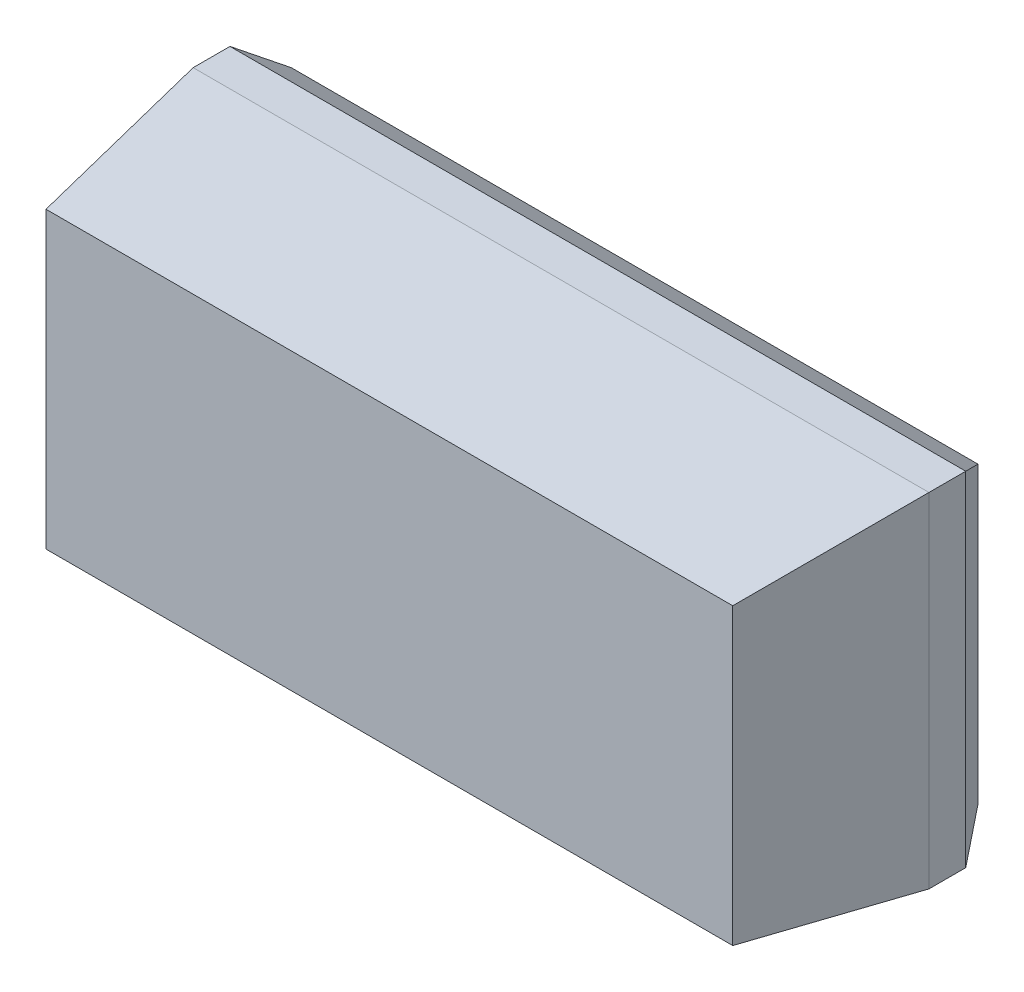
ISO-10303-21;
HEADER;
FILE_DESCRIPTION(('STEP AP214'),'2;1');
FILE_NAME('part.step','',(''),(''),'','','');
FILE_SCHEMA(('AUTOMOTIVE_DESIGN { 1 0 10303 214 1 1 1 1 }'));
ENDSEC;
DATA;
#1=APPLICATION_CONTEXT('core data for automotive mechanical design processes');
#2=APPLICATION_PROTOCOL_DEFINITION('international standard','automotive_design',2000,#1);
#3=PRODUCT_CONTEXT('',#1,'mechanical');
#4=PRODUCT('Part','Part','',(#3));
#5=PRODUCT_RELATED_PRODUCT_CATEGORY('part','',(#4));
#6=PRODUCT_DEFINITION_FORMATION('','',#4);
#7=PRODUCT_DEFINITION_CONTEXT('part definition',#1,'design');
#8=PRODUCT_DEFINITION('design','',#6,#7);
#9=PRODUCT_DEFINITION_SHAPE('','',#8);
#10=(LENGTH_UNIT() NAMED_UNIT(*) SI_UNIT(.MILLI.,.METRE.));
#11=(NAMED_UNIT(*) PLANE_ANGLE_UNIT() SI_UNIT($,.RADIAN.));
#12=(NAMED_UNIT(*) SI_UNIT($,.STERADIAN.) SOLID_ANGLE_UNIT());
#13=UNCERTAINTY_MEASURE_WITH_UNIT(LENGTH_MEASURE(1.E-05),#10,'distance_accuracy_value','');
#14=(GEOMETRIC_REPRESENTATION_CONTEXT(3) GLOBAL_UNCERTAINTY_ASSIGNED_CONTEXT((#13)) GLOBAL_UNIT_ASSIGNED_CONTEXT((#10,
#11,#12)) REPRESENTATION_CONTEXT('',''));
#15=CARTESIAN_POINT('',(0.,0.,0.));
#16=DIRECTION('',(0.,0.,1.));
#17=DIRECTION('',(1.,0.,0.));
#18=AXIS2_PLACEMENT_3D('',#15,#16,#17);
#19=CARTESIAN_POINT('',(0.,0.,0.));
#20=DIRECTION('',(0.,0.,1.));
#21=DIRECTION('',(1.,0.,0.));
#22=AXIS2_PLACEMENT_3D('',#19,#20,#21);
#23=PLANE('',#22);
#24=DIRECTION('',(0.,1.,0.));
#25=VECTOR('',#24,1.);
#26=CARTESIAN_POINT('',(1.40000000000004,-0.7,0.));
#27=LINE('',#26,#25);
#28=CARTESIAN_POINT('',(1.40000000000002,0.60000000000001,0.));
#29=VERTEX_POINT('',#28);
#30=CARTESIAN_POINT('',(1.40000000000001,-0.600000000000021,0.));
#31=VERTEX_POINT('',#30);
#32=EDGE_CURVE('E93',#29,#31,#27,.F.);
#33=ORIENTED_EDGE('',*,*,#32,.T.);
#34=DIRECTION('',(1.,0.,0.));
#35=VECTOR('',#34,1.);
#36=CARTESIAN_POINT('',(-1.5,-0.600000000000042,0.));
#37=LINE('',#36,#35);
#38=CARTESIAN_POINT('',(-1.40000000000002,-0.60000000000001,0.));
#39=VERTEX_POINT('',#38);
#40=EDGE_CURVE('E80',#31,#39,#37,.F.);
#41=ORIENTED_EDGE('',*,*,#40,.T.);
#42=DIRECTION('',(0.,1.,0.));
#43=VECTOR('',#42,1.);
#44=CARTESIAN_POINT('',(-1.40000000000004,0.7,0.));
#45=LINE('',#44,#43);
#46=CARTESIAN_POINT('',(-1.40000000000002,0.60000000000001,0.));
#47=VERTEX_POINT('',#46);
#48=EDGE_CURVE('E20',#39,#47,#45,.T.);
#49=ORIENTED_EDGE('',*,*,#48,.T.);
#50=DIRECTION('',(1.,0.,0.));
#51=VECTOR('',#50,1.);
#52=CARTESIAN_POINT('',(1.5,0.600000000000042,0.));
#53=LINE('',#52,#51);
#54=EDGE_CURVE('E108',#47,#29,#53,.T.);
#55=ORIENTED_EDGE('',*,*,#54,.T.);
#56=EDGE_LOOP('',(#33,#41,#49,#55));
#57=FACE_BOUND('',#56,.T.);
#58=ADVANCED_FACE('F17',(#57),#23,.F.);
#59=CARTESIAN_POINT('',(-1.5,0.7,0.15));
#60=DIRECTION('',(0.832050294337997,0.,0.554700196224998));
#61=DIRECTION('',(0.554700196224998,0.,-0.832050294337997));
#62=AXIS2_PLACEMENT_3D('',#59,#60,#61);
#63=PLANE('',#62);
#64=DIRECTION('',(0.485071250072667,-0.485071250072464,-0.727606875109133));
#65=VECTOR('',#64,1.);
#66=CARTESIAN_POINT('',(-1.5,0.7,0.15));
#67=LINE('',#66,#65);
#68=CARTESIAN_POINT('',(-1.5,0.7,0.15));
#69=VERTEX_POINT('',#68);
#70=EDGE_CURVE('E89',#69,#47,#67,.T.);
#71=ORIENTED_EDGE('',*,*,#70,.T.);
#72=ORIENTED_EDGE('',*,*,#48,.F.);
#73=DIRECTION('',(-0.485071250072666,-0.485071250072464,0.727606875109133));
#74=VECTOR('',#73,1.);
#75=CARTESIAN_POINT('',(-1.4,-0.600000000000042,0.));
#76=LINE('',#75,#74);
#77=CARTESIAN_POINT('',(-1.5,-0.7,0.15));
#78=VERTEX_POINT('',#77);
#79=EDGE_CURVE('E86',#39,#78,#76,.T.);
#80=ORIENTED_EDGE('',*,*,#79,.T.);
#81=DIRECTION('',(0.,1.,0.));
#82=VECTOR('',#81,1.);
#83=CARTESIAN_POINT('',(-1.5,0.7,0.15));
#84=LINE('',#83,#82);
#85=EDGE_CURVE('E110',#78,#69,#84,.T.);
#86=ORIENTED_EDGE('',*,*,#85,.T.);
#87=EDGE_LOOP('',(#71,#72,#80,#86));
#88=FACE_BOUND('',#87,.T.);
#89=ADVANCED_FACE('F85',(#88),#63,.F.);
#90=CARTESIAN_POINT('',(-1.5,-0.7,0.15));
#91=DIRECTION('',(0.,0.832050294337997,0.554700196224998));
#92=DIRECTION('',(0.,-0.554700196224998,0.832050294337997));
#93=AXIS2_PLACEMENT_3D('',#90,#91,#92);
#94=PLANE('',#93);
#95=DIRECTION('',(0.485071250072464,-0.485071250072666,0.727606875109133));
#96=VECTOR('',#95,1.);
#97=CARTESIAN_POINT('',(1.40000000000004,-0.6,0.));
#98=LINE('',#97,#96);
#99=CARTESIAN_POINT('',(1.5,-0.7,0.15));
#100=VERTEX_POINT('',#99);
#101=EDGE_CURVE('E95',#31,#100,#98,.T.);
#102=ORIENTED_EDGE('',*,*,#101,.T.);
#103=DIRECTION('',(1.,0.,0.));
#104=VECTOR('',#103,1.);
#105=CARTESIAN_POINT('',(-1.5,-0.7,0.15));
#106=LINE('',#105,#104);
#107=EDGE_CURVE('E100',#100,#78,#106,.F.);
#108=ORIENTED_EDGE('',*,*,#107,.T.);
#109=ORIENTED_EDGE('',*,*,#79,.F.);
#110=ORIENTED_EDGE('',*,*,#40,.F.);
#111=EDGE_LOOP('',(#102,#108,#109,#110));
#112=FACE_BOUND('',#111,.T.);
#113=ADVANCED_FACE('F98',(#112),#94,.F.);
#114=CARTESIAN_POINT('',(1.5,-0.7,0.15));
#115=DIRECTION('',(-0.832050294337997,0.,0.554700196224998));
#116=DIRECTION('',(0.554700196224998,0.,0.832050294337997));
#117=AXIS2_PLACEMENT_3D('',#114,#115,#116);
#118=PLANE('',#117);
#119=DIRECTION('',(0.485071250072666,0.485071250072464,0.727606875109133));
#120=VECTOR('',#119,1.);
#121=CARTESIAN_POINT('',(1.4,0.600000000000042,0.));
#122=LINE('',#121,#120);
#123=CARTESIAN_POINT('',(1.5,0.7,0.15));
#124=VERTEX_POINT('',#123);
#125=EDGE_CURVE('E105',#29,#124,#122,.T.);
#126=ORIENTED_EDGE('',*,*,#125,.T.);
#127=DIRECTION('',(0.,-1.,0.));
#128=VECTOR('',#127,1.);
#129=CARTESIAN_POINT('',(1.5,-0.7,0.15));
#130=LINE('',#129,#128);
#131=EDGE_CURVE('E117',#124,#100,#130,.T.);
#132=ORIENTED_EDGE('',*,*,#131,.T.);
#133=ORIENTED_EDGE('',*,*,#101,.F.);
#134=ORIENTED_EDGE('',*,*,#32,.F.);
#135=EDGE_LOOP('',(#126,#132,#133,#134));
#136=FACE_BOUND('',#135,.T.);
#137=ADVANCED_FACE('F184',(#136),#118,.F.);
#138=CARTESIAN_POINT('',(1.5,0.7,0.15));
#139=DIRECTION('',(0.,-0.832050294337997,0.554700196224998));
#140=DIRECTION('',(0.,-0.554700196224998,-0.832050294337997));
#141=AXIS2_PLACEMENT_3D('',#138,#139,#140);
#142=PLANE('',#141);
#143=ORIENTED_EDGE('',*,*,#70,.F.);
#144=DIRECTION('',(1.,0.,0.));
#145=VECTOR('',#144,1.);
#146=CARTESIAN_POINT('',(1.5,0.7,0.15));
#147=LINE('',#146,#145);
#148=EDGE_CURVE('E125',#69,#124,#147,.T.);
#149=ORIENTED_EDGE('',*,*,#148,.T.);
#150=ORIENTED_EDGE('',*,*,#125,.F.);
#151=ORIENTED_EDGE('',*,*,#54,.F.);
#152=EDGE_LOOP('',(#143,#149,#150,#151));
#153=FACE_BOUND('',#152,.T.);
#154=ADVANCED_FACE('F187',(#153),#142,.F.);
#155=CARTESIAN_POINT('',(-1.5,0.7,1.));
#156=DIRECTION('',(1.,0.,0.));
#157=DIRECTION('',(0.,1.,0.));
#158=AXIS2_PLACEMENT_3D('',#155,#156,#157);
#159=PLANE('',#158);
#160=DIRECTION('',(0.,0.,1.));
#161=VECTOR('',#160,1.);
#162=CARTESIAN_POINT('',(-1.5,-0.7,1.));
#163=LINE('',#162,#161);
#164=CARTESIAN_POINT('',(-1.49999999999995,-0.699999999999975,0.299999999999989));
#165=VERTEX_POINT('',#164);
#166=EDGE_CURVE('E112',#78,#165,#163,.T.);
#167=ORIENTED_EDGE('',*,*,#166,.T.);
#168=DIRECTION('',(0.,1.,0.));
#169=VECTOR('',#168,1.);
#170=CARTESIAN_POINT('',(-1.4999999999998,0.,0.299999999999972));
#171=LINE('',#170,#169);
#172=CARTESIAN_POINT('',(-1.49999999999995,0.699999999999975,0.299999999999989));
#173=VERTEX_POINT('',#172);
#174=EDGE_CURVE('E128',#173,#165,#171,.F.);
#175=ORIENTED_EDGE('',*,*,#174,.F.);
#176=DIRECTION('',(0.,0.,-1.));
#177=VECTOR('',#176,1.);
#178=CARTESIAN_POINT('',(-1.5,0.7,1.));
#179=LINE('',#178,#177);
#180=EDGE_CURVE('E122',#173,#69,#179,.T.);
#181=ORIENTED_EDGE('',*,*,#180,.T.);
#182=ORIENTED_EDGE('',*,*,#85,.F.);
#183=EDGE_LOOP('',(#167,#175,#181,#182));
#184=FACE_BOUND('',#183,.T.);
#185=ADVANCED_FACE('F181',(#184),#159,.F.);
#186=CARTESIAN_POINT('',(-1.5,-0.7,1.));
#187=DIRECTION('',(0.,1.,0.));
#188=DIRECTION('',(0.,0.,1.));
#189=AXIS2_PLACEMENT_3D('',#186,#187,#188);
#190=PLANE('',#189);
#191=DIRECTION('',(0.,0.,1.));
#192=VECTOR('',#191,1.);
#193=CARTESIAN_POINT('',(1.5,-0.7,1.));
#194=LINE('',#193,#192);
#195=CARTESIAN_POINT('',(1.49999999999998,-0.69999999999995,0.299999999999989));
#196=VERTEX_POINT('',#195);
#197=EDGE_CURVE('E115',#100,#196,#194,.T.);
#198=ORIENTED_EDGE('',*,*,#197,.T.);
#199=DIRECTION('',(1.,0.,0.));
#200=VECTOR('',#199,1.);
#201=CARTESIAN_POINT('',(0.,-0.699999999999802,0.299999999999972));
#202=LINE('',#201,#200);
#203=EDGE_CURVE('E134',#165,#196,#202,.T.);
#204=ORIENTED_EDGE('',*,*,#203,.F.);
#205=ORIENTED_EDGE('',*,*,#166,.F.);
#206=ORIENTED_EDGE('',*,*,#107,.F.);
#207=EDGE_LOOP('',(#198,#204,#205,#206));
#208=FACE_BOUND('',#207,.T.);
#209=ADVANCED_FACE('F182',(#208),#190,.F.);
#210=CARTESIAN_POINT('',(1.5,-0.7,1.));
#211=DIRECTION('',(-1.,0.,0.));
#212=DIRECTION('',(0.,-1.,0.));
#213=AXIS2_PLACEMENT_3D('',#210,#211,#212);
#214=PLANE('',#213);
#215=DIRECTION('',(0.,0.,-1.));
#216=VECTOR('',#215,1.);
#217=CARTESIAN_POINT('',(1.5,0.7,1.));
#218=LINE('',#217,#216);
#219=CARTESIAN_POINT('',(1.49999999999995,0.699999999999975,0.299999999999989));
#220=VERTEX_POINT('',#219);
#221=EDGE_CURVE('E120',#124,#220,#218,.F.);
#222=ORIENTED_EDGE('',*,*,#221,.T.);
#223=DIRECTION('',(0.,1.,0.));
#224=VECTOR('',#223,1.);
#225=CARTESIAN_POINT('',(1.4999999999998,0.,0.299999999999972));
#226=LINE('',#225,#224);
#227=EDGE_CURVE('E140',#196,#220,#226,.T.);
#228=ORIENTED_EDGE('',*,*,#227,.F.);
#229=ORIENTED_EDGE('',*,*,#197,.F.);
#230=ORIENTED_EDGE('',*,*,#131,.F.);
#231=EDGE_LOOP('',(#222,#228,#229,#230));
#232=FACE_BOUND('',#231,.T.);
#233=ADVANCED_FACE('F168',(#232),#214,.F.);
#234=CARTESIAN_POINT('',(1.5,0.7,1.));
#235=DIRECTION('',(0.,-1.,0.));
#236=DIRECTION('',(0.,0.,-1.));
#237=AXIS2_PLACEMENT_3D('',#234,#235,#236);
#238=PLANE('',#237);
#239=ORIENTED_EDGE('',*,*,#180,.F.);
#240=DIRECTION('',(1.,0.,0.));
#241=VECTOR('',#240,1.);
#242=CARTESIAN_POINT('',(0.,0.699999999999802,0.299999999999972));
#243=LINE('',#242,#241);
#244=EDGE_CURVE('E146',#220,#173,#243,.F.);
#245=ORIENTED_EDGE('',*,*,#244,.F.);
#246=ORIENTED_EDGE('',*,*,#221,.F.);
#247=ORIENTED_EDGE('',*,*,#148,.F.);
#248=EDGE_LOOP('',(#239,#245,#246,#247));
#249=FACE_BOUND('',#248,.T.);
#250=ADVANCED_FACE('F174',(#249),#238,.F.);
#251=CARTESIAN_POINT('',(-1.4,0.,1.));
#252=DIRECTION('',(-0.989949493661207,0.,0.14142135623703));
#253=DIRECTION('',(0.14142135623703,0.,0.989949493661207));
#254=AXIS2_PLACEMENT_3D('',#251,#252,#253);
#255=PLANE('',#254);
#256=DIRECTION('',(-0.140028008402801,-0.140028008402524,-0.980196058819646));
#257=VECTOR('',#256,1.);
#258=CARTESIAN_POINT('',(-1.4,-0.6,1.));
#259=LINE('',#258,#257);
#260=CARTESIAN_POINT('',(-1.4,-0.6,1.));
#261=VERTEX_POINT('',#260);
#262=EDGE_CURVE('E131',#261,#165,#259,.T.);
#263=ORIENTED_EDGE('',*,*,#262,.F.);
#264=DIRECTION('',(0.,1.,0.));
#265=VECTOR('',#264,1.);
#266=CARTESIAN_POINT('',(-1.4,0.,1.));
#267=LINE('',#266,#265);
#268=CARTESIAN_POINT('',(-1.4,0.6,1.));
#269=VERTEX_POINT('',#268);
#270=EDGE_CURVE('E149',#269,#261,#267,.F.);
#271=ORIENTED_EDGE('',*,*,#270,.F.);
#272=DIRECTION('',(0.140028008402801,-0.140028008402524,0.980196058819646));
#273=VECTOR('',#272,1.);
#274=CARTESIAN_POINT('',(-1.5,0.699999999999802,0.299999999999972));
#275=LINE('',#274,#273);
#276=EDGE_CURVE('E142',#173,#269,#275,.T.);
#277=ORIENTED_EDGE('',*,*,#276,.F.);
#278=ORIENTED_EDGE('',*,*,#174,.T.);
#279=EDGE_LOOP('',(#263,#271,#277,#278));
#280=FACE_BOUND('',#279,.T.);
#281=ADVANCED_FACE('F179',(#280),#255,.T.);
#282=CARTESIAN_POINT('',(0.,-0.6,1.));
#283=DIRECTION('',(0.,-0.989949493661207,0.14142135623703));
#284=DIRECTION('',(0.,-0.14142135623703,-0.989949493661207));
#285=AXIS2_PLACEMENT_3D('',#282,#283,#284);
#286=PLANE('',#285);
#287=ORIENTED_EDGE('',*,*,#262,.T.);
#288=ORIENTED_EDGE('',*,*,#203,.T.);
#289=DIRECTION('',(0.140028008402524,-0.140028008402801,-0.980196058819646));
#290=VECTOR('',#289,1.);
#291=CARTESIAN_POINT('',(1.4,-0.6,1.));
#292=LINE('',#291,#290);
#293=CARTESIAN_POINT('',(1.4,-0.6,1.));
#294=VERTEX_POINT('',#293);
#295=EDGE_CURVE('E137',#294,#196,#292,.T.);
#296=ORIENTED_EDGE('',*,*,#295,.F.);
#297=DIRECTION('',(1.,0.,0.));
#298=VECTOR('',#297,1.);
#299=CARTESIAN_POINT('',(0.,-0.6,1.));
#300=LINE('',#299,#298);
#301=EDGE_CURVE('E152',#261,#294,#300,.T.);
#302=ORIENTED_EDGE('',*,*,#301,.F.);
#303=EDGE_LOOP('',(#287,#288,#296,#302));
#304=FACE_BOUND('',#303,.T.);
#305=ADVANCED_FACE('F163',(#304),#286,.T.);
#306=CARTESIAN_POINT('',(1.4,0.,1.));
#307=DIRECTION('',(0.989949493661207,0.,0.14142135623703));
#308=DIRECTION('',(0.14142135623703,0.,-0.989949493661207));
#309=AXIS2_PLACEMENT_3D('',#306,#307,#308);
#310=PLANE('',#309);
#311=ORIENTED_EDGE('',*,*,#295,.T.);
#312=ORIENTED_EDGE('',*,*,#227,.T.);
#313=DIRECTION('',(0.140028008402801,0.140028008402524,-0.980196058819646));
#314=VECTOR('',#313,1.);
#315=CARTESIAN_POINT('',(1.4,0.6,1.));
#316=LINE('',#315,#314);
#317=CARTESIAN_POINT('',(1.4,0.6,1.));
#318=VERTEX_POINT('',#317);
#319=EDGE_CURVE('E35',#318,#220,#316,.T.);
#320=ORIENTED_EDGE('',*,*,#319,.F.);
#321=DIRECTION('',(0.,1.,0.));
#322=VECTOR('',#321,1.);
#323=CARTESIAN_POINT('',(1.4,0.,1.));
#324=LINE('',#323,#322);
#325=EDGE_CURVE('E26',#294,#318,#324,.T.);
#326=ORIENTED_EDGE('',*,*,#325,.F.);
#327=EDGE_LOOP('',(#311,#312,#320,#326));
#328=FACE_BOUND('',#327,.T.);
#329=ADVANCED_FACE('F159',(#328),#310,.T.);
#330=CARTESIAN_POINT('',(0.,0.6,1.));
#331=DIRECTION('',(0.,0.989949493661207,0.14142135623703));
#332=DIRECTION('',(0.,-0.14142135623703,0.989949493661207));
#333=AXIS2_PLACEMENT_3D('',#330,#331,#332);
#334=PLANE('',#333);
#335=ORIENTED_EDGE('',*,*,#319,.T.);
#336=ORIENTED_EDGE('',*,*,#244,.T.);
#337=ORIENTED_EDGE('',*,*,#276,.T.);
#338=DIRECTION('',(1.,0.,0.));
#339=VECTOR('',#338,1.);
#340=CARTESIAN_POINT('',(0.,0.6,1.));
#341=LINE('',#340,#339);
#342=EDGE_CURVE('E11',#318,#269,#341,.F.);
#343=ORIENTED_EDGE('',*,*,#342,.F.);
#344=EDGE_LOOP('',(#335,#336,#337,#343));
#345=FACE_BOUND('',#344,.T.);
#346=ADVANCED_FACE('F176',(#345),#334,.T.);
#347=CARTESIAN_POINT('',(0.,0.,1.));
#348=DIRECTION('',(0.,0.,1.));
#349=DIRECTION('',(1.,0.,0.));
#350=AXIS2_PLACEMENT_3D('',#347,#348,#349);
#351=PLANE('',#350);
#352=ORIENTED_EDGE('',*,*,#325,.T.);
#353=ORIENTED_EDGE('',*,*,#342,.T.);
#354=ORIENTED_EDGE('',*,*,#270,.T.);
#355=ORIENTED_EDGE('',*,*,#301,.T.);
#356=EDGE_LOOP('',(#352,#353,#354,#355));
#357=FACE_BOUND('',#356,.T.);
#358=ADVANCED_FACE('F157',(#357),#351,.T.);
#359=CLOSED_SHELL('',(#58,#89,#113,#137,#154,#185,#209,#233,#250,#281,#305,#329,#346,#358));
#360=MANIFOLD_SOLID_BREP('B1',#359);
#361=ADVANCED_BREP_SHAPE_REPRESENTATION('',(#18,#360),#14);
#362=SHAPE_DEFINITION_REPRESENTATION(#9,#361);
ENDSEC;
END-ISO-10303-21;
